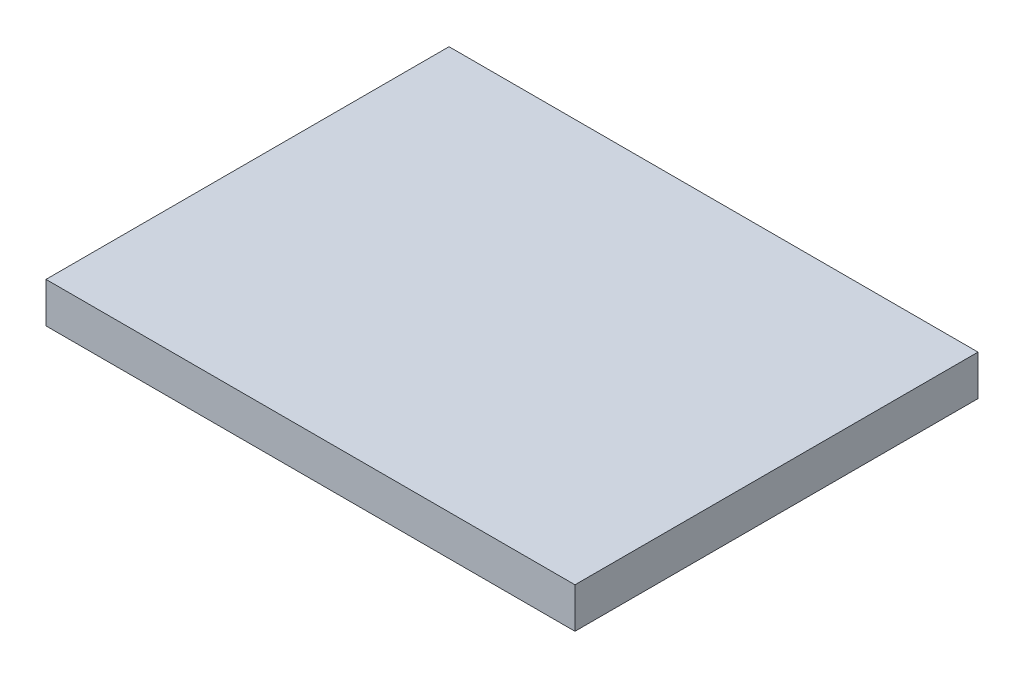
ISO-10303-21;
HEADER;
FILE_DESCRIPTION(('STEP AP214'),'2;1');
FILE_NAME('part.step','',(''),(''),'','','');
FILE_SCHEMA(('AUTOMOTIVE_DESIGN { 1 0 10303 214 1 1 1 1 }'));
ENDSEC;
DATA;
#1=APPLICATION_CONTEXT('core data for automotive mechanical design processes');
#2=APPLICATION_PROTOCOL_DEFINITION('international standard','automotive_design',2000,#1);
#3=PRODUCT_CONTEXT('',#1,'mechanical');
#4=PRODUCT('Part','Part','',(#3));
#5=PRODUCT_RELATED_PRODUCT_CATEGORY('part','',(#4));
#6=PRODUCT_DEFINITION_FORMATION('','',#4);
#7=PRODUCT_DEFINITION_CONTEXT('part definition',#1,'design');
#8=PRODUCT_DEFINITION('design','',#6,#7);
#9=PRODUCT_DEFINITION_SHAPE('','',#8);
#10=(LENGTH_UNIT() NAMED_UNIT(*) SI_UNIT(.MILLI.,.METRE.));
#11=(NAMED_UNIT(*) PLANE_ANGLE_UNIT() SI_UNIT($,.RADIAN.));
#12=(NAMED_UNIT(*) SI_UNIT($,.STERADIAN.) SOLID_ANGLE_UNIT());
#13=UNCERTAINTY_MEASURE_WITH_UNIT(LENGTH_MEASURE(1.E-05),#10,'distance_accuracy_value','');
#14=(GEOMETRIC_REPRESENTATION_CONTEXT(3) GLOBAL_UNCERTAINTY_ASSIGNED_CONTEXT((#13)) GLOBAL_UNIT_ASSIGNED_CONTEXT((#10,
#11,#12)) REPRESENTATION_CONTEXT('',''));
#15=CARTESIAN_POINT('',(0.,0.,0.));
#16=DIRECTION('',(0.,0.,1.));
#17=DIRECTION('',(1.,0.,0.));
#18=AXIS2_PLACEMENT_3D('',#15,#16,#17);
#19=CARTESIAN_POINT('',(10.5,1.6,8.));
#20=DIRECTION('',(-1.,0.,0.));
#21=DIRECTION('',(0.,0.,1.));
#22=AXIS2_PLACEMENT_3D('',#19,#20,#21);
#23=PLANE('',#22);
#24=DIRECTION('',(0.,0.,-1.));
#25=VECTOR('',#24,1.);
#26=CARTESIAN_POINT('',(10.5,0.,8.));
#27=LINE('',#26,#25);
#28=CARTESIAN_POINT('',(10.5,0.,8.));
#29=VERTEX_POINT('',#28);
#30=CARTESIAN_POINT('',(10.5,0.,-8.));
#31=VERTEX_POINT('',#30);
#32=EDGE_CURVE('E96',#29,#31,#27,.T.);
#33=ORIENTED_EDGE('',*,*,#32,.T.);
#34=DIRECTION('',(0.,-1.,0.));
#35=VECTOR('',#34,1.);
#36=CARTESIAN_POINT('',(10.5,1.6,-8.));
#37=LINE('',#36,#35);
#38=CARTESIAN_POINT('',(10.5,1.6,-8.));
#39=VERTEX_POINT('',#38);
#40=EDGE_CURVE('E11',#39,#31,#37,.T.);
#41=ORIENTED_EDGE('',*,*,#40,.F.);
#42=DIRECTION('',(0.,0.,-1.));
#43=VECTOR('',#42,1.);
#44=CARTESIAN_POINT('',(10.5,1.6,8.));
#45=LINE('',#44,#43);
#46=CARTESIAN_POINT('',(10.5,1.6,8.));
#47=VERTEX_POINT('',#46);
#48=EDGE_CURVE('E84',#47,#39,#45,.T.);
#49=ORIENTED_EDGE('',*,*,#48,.F.);
#50=DIRECTION('',(0.,-1.,0.));
#51=VECTOR('',#50,1.);
#52=CARTESIAN_POINT('',(10.5,1.6,8.));
#53=LINE('',#52,#51);
#54=EDGE_CURVE('E92',#47,#29,#53,.T.);
#55=ORIENTED_EDGE('',*,*,#54,.T.);
#56=EDGE_LOOP('',(#33,#41,#49,#55));
#57=FACE_BOUND('',#56,.T.);
#58=ADVANCED_FACE('F33',(#57),#23,.F.);
#59=CARTESIAN_POINT('',(-10.5,1.6,-8.));
#60=DIRECTION('',(0.,0.,1.));
#61=DIRECTION('',(1.,0.,0.));
#62=AXIS2_PLACEMENT_3D('',#59,#60,#61);
#63=PLANE('',#62);
#64=DIRECTION('',(-1.,0.,0.));
#65=VECTOR('',#64,1.);
#66=CARTESIAN_POINT('',(-10.5,0.,-8.));
#67=LINE('',#66,#65);
#68=CARTESIAN_POINT('',(-10.5,0.,-8.));
#69=VERTEX_POINT('',#68);
#70=EDGE_CURVE('E88',#31,#69,#67,.T.);
#71=ORIENTED_EDGE('',*,*,#70,.T.);
#72=DIRECTION('',(0.,-1.,0.));
#73=VECTOR('',#72,1.);
#74=CARTESIAN_POINT('',(-10.5,1.6,-8.));
#75=LINE('',#74,#73);
#76=CARTESIAN_POINT('',(-10.5,1.6,-8.));
#77=VERTEX_POINT('',#76);
#78=EDGE_CURVE('E41',#77,#69,#75,.T.);
#79=ORIENTED_EDGE('',*,*,#78,.F.);
#80=DIRECTION('',(-1.,0.,0.));
#81=VECTOR('',#80,1.);
#82=CARTESIAN_POINT('',(-10.5,1.6,-8.));
#83=LINE('',#82,#81);
#84=EDGE_CURVE('E79',#39,#77,#83,.T.);
#85=ORIENTED_EDGE('',*,*,#84,.F.);
#86=ORIENTED_EDGE('',*,*,#40,.T.);
#87=EDGE_LOOP('',(#71,#79,#85,#86));
#88=FACE_BOUND('',#87,.T.);
#89=ADVANCED_FACE('F87',(#88),#63,.F.);
#90=CARTESIAN_POINT('',(-10.5,1.6,8.));
#91=DIRECTION('',(1.,0.,0.));
#92=DIRECTION('',(0.,0.,-1.));
#93=AXIS2_PLACEMENT_3D('',#90,#91,#92);
#94=PLANE('',#93);
#95=DIRECTION('',(0.,0.,1.));
#96=VECTOR('',#95,1.);
#97=CARTESIAN_POINT('',(-10.5,0.,8.));
#98=LINE('',#97,#96);
#99=CARTESIAN_POINT('',(-10.5,0.,8.));
#100=VERTEX_POINT('',#99);
#101=EDGE_CURVE('E66',#69,#100,#98,.T.);
#102=ORIENTED_EDGE('',*,*,#101,.T.);
#103=DIRECTION('',(0.,-1.,0.));
#104=VECTOR('',#103,1.);
#105=CARTESIAN_POINT('',(-10.5,1.6,8.));
#106=LINE('',#105,#104);
#107=CARTESIAN_POINT('',(-10.5,1.6,8.));
#108=VERTEX_POINT('',#107);
#109=EDGE_CURVE('E89',#108,#100,#106,.T.);
#110=ORIENTED_EDGE('',*,*,#109,.F.);
#111=DIRECTION('',(0.,0.,1.));
#112=VECTOR('',#111,1.);
#113=CARTESIAN_POINT('',(-10.5,1.6,8.));
#114=LINE('',#113,#112);
#115=EDGE_CURVE('E82',#77,#108,#114,.T.);
#116=ORIENTED_EDGE('',*,*,#115,.F.);
#117=ORIENTED_EDGE('',*,*,#78,.T.);
#118=EDGE_LOOP('',(#102,#110,#116,#117));
#119=FACE_BOUND('',#118,.T.);
#120=ADVANCED_FACE('F90',(#119),#94,.F.);
#121=CARTESIAN_POINT('',(-10.5,1.6,8.));
#122=DIRECTION('',(0.,0.,-1.));
#123=DIRECTION('',(-1.,0.,0.));
#124=AXIS2_PLACEMENT_3D('',#121,#122,#123);
#125=PLANE('',#124);
#126=DIRECTION('',(1.,0.,0.));
#127=VECTOR('',#126,1.);
#128=CARTESIAN_POINT('',(-10.5,0.,8.));
#129=LINE('',#128,#127);
#130=EDGE_CURVE('E72',#100,#29,#129,.T.);
#131=ORIENTED_EDGE('',*,*,#130,.T.);
#132=ORIENTED_EDGE('',*,*,#54,.F.);
#133=DIRECTION('',(1.,0.,0.));
#134=VECTOR('',#133,1.);
#135=CARTESIAN_POINT('',(-10.5,1.6,8.));
#136=LINE('',#135,#134);
#137=EDGE_CURVE('E49',#108,#47,#136,.T.);
#138=ORIENTED_EDGE('',*,*,#137,.F.);
#139=ORIENTED_EDGE('',*,*,#109,.T.);
#140=EDGE_LOOP('',(#131,#132,#138,#139));
#141=FACE_BOUND('',#140,.T.);
#142=ADVANCED_FACE('F103',(#141),#125,.F.);
#143=CARTESIAN_POINT('',(0.,1.6,0.));
#144=DIRECTION('',(0.,-1.,0.));
#145=DIRECTION('',(0.,0.,-1.));
#146=AXIS2_PLACEMENT_3D('',#143,#144,#145);
#147=PLANE('',#146);
#148=ORIENTED_EDGE('',*,*,#48,.T.);
#149=ORIENTED_EDGE('',*,*,#84,.T.);
#150=ORIENTED_EDGE('',*,*,#115,.T.);
#151=ORIENTED_EDGE('',*,*,#137,.T.);
#152=EDGE_LOOP('',(#148,#149,#150,#151));
#153=FACE_BOUND('',#152,.T.);
#154=ADVANCED_FACE('F80',(#153),#147,.F.);
#155=CARTESIAN_POINT('',(0.,0.,0.));
#156=DIRECTION('',(0.,-1.,0.));
#157=DIRECTION('',(0.,0.,-1.));
#158=AXIS2_PLACEMENT_3D('',#155,#156,#157);
#159=PLANE('',#158);
#160=ORIENTED_EDGE('',*,*,#32,.F.);
#161=ORIENTED_EDGE('',*,*,#130,.F.);
#162=ORIENTED_EDGE('',*,*,#101,.F.);
#163=ORIENTED_EDGE('',*,*,#70,.F.);
#164=EDGE_LOOP('',(#160,#161,#162,#163));
#165=FACE_BOUND('',#164,.T.);
#166=ADVANCED_FACE('F106',(#165),#159,.T.);
#167=CLOSED_SHELL('',(#58,#89,#120,#142,#154,#166));
#168=MANIFOLD_SOLID_BREP('B2',#167);
#169=ADVANCED_BREP_SHAPE_REPRESENTATION('',(#18,#168),#14);
#170=SHAPE_DEFINITION_REPRESENTATION(#9,#169);
ENDSEC;
END-ISO-10303-21;
